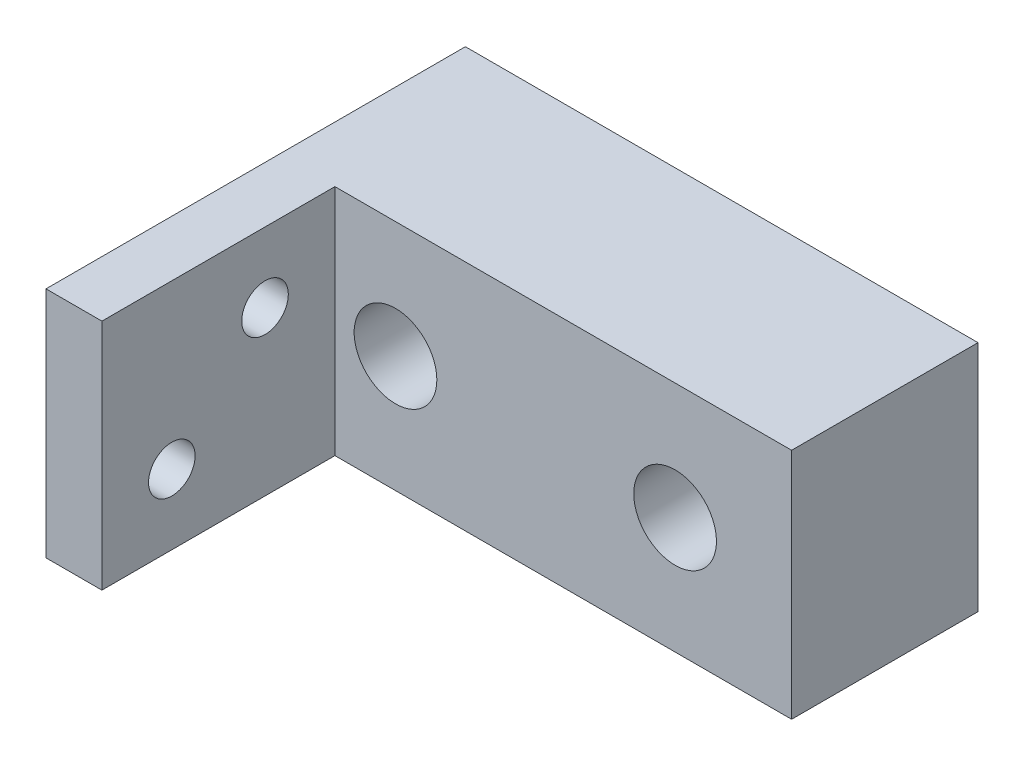
ISO-10303-21;
HEADER;
FILE_DESCRIPTION(('STEP AP214'),'2;1');
FILE_NAME('part.step','',(''),(''),'','','');
FILE_SCHEMA(('AUTOMOTIVE_DESIGN { 1 0 10303 214 1 1 1 1 }'));
ENDSEC;
DATA;
#1=APPLICATION_CONTEXT('core data for automotive mechanical design processes');
#2=APPLICATION_PROTOCOL_DEFINITION('international standard','automotive_design',2000,#1);
#3=PRODUCT_CONTEXT('',#1,'mechanical');
#4=PRODUCT('Part','Part','',(#3));
#5=PRODUCT_RELATED_PRODUCT_CATEGORY('part','',(#4));
#6=PRODUCT_DEFINITION_FORMATION('','',#4);
#7=PRODUCT_DEFINITION_CONTEXT('part definition',#1,'design');
#8=PRODUCT_DEFINITION('design','',#6,#7);
#9=PRODUCT_DEFINITION_SHAPE('','',#8);
#10=(LENGTH_UNIT() NAMED_UNIT(*) SI_UNIT(.MILLI.,.METRE.));
#11=(NAMED_UNIT(*) PLANE_ANGLE_UNIT() SI_UNIT($,.RADIAN.));
#12=(NAMED_UNIT(*) SI_UNIT($,.STERADIAN.) SOLID_ANGLE_UNIT());
#13=UNCERTAINTY_MEASURE_WITH_UNIT(LENGTH_MEASURE(1.E-05),#10,'distance_accuracy_value','');
#14=(GEOMETRIC_REPRESENTATION_CONTEXT(3) GLOBAL_UNCERTAINTY_ASSIGNED_CONTEXT((#13)) GLOBAL_UNIT_ASSIGNED_CONTEXT((#10,
#11,#12)) REPRESENTATION_CONTEXT('',''));
#15=CARTESIAN_POINT('',(0.,0.,0.));
#16=DIRECTION('',(0.,0.,1.));
#17=DIRECTION('',(1.,0.,0.));
#18=AXIS2_PLACEMENT_3D('',#15,#16,#17);
#19=CARTESIAN_POINT('',(0.,0.,20.));
#20=DIRECTION('',(0.,0.,-1.));
#21=DIRECTION('',(-1.,0.,0.));
#22=AXIS2_PLACEMENT_3D('',#19,#20,#21);
#23=PLANE('',#22);
#24=CARTESIAN_POINT('',(-7.68133333333334,7.82775566512345,20.));
#25=DIRECTION('',(0.,0.,1.));
#26=DIRECTION('',(-1.,0.,0.));
#27=AXIS2_PLACEMENT_3D('',#24,#25,#26);
#28=CIRCLE('',#27,4.43590065730548);
#29=CARTESIAN_POINT('',(-12.1172339906388,7.82775566512345,20.));
#30=VERTEX_POINT('',#29);
#31=EDGE_CURVE('E152',#30,#30,#28,.T.);
#32=ORIENTED_EDGE('',*,*,#31,.F.);
#33=EDGE_LOOP('',(#32));
#34=FACE_BOUND('',#33,.T.);
#35=CARTESIAN_POINT('',(-37.6813333333333,7.82775566512345,20.));
#36=DIRECTION('',(0.,0.,1.));
#37=DIRECTION('',(1.,0.,0.));
#38=AXIS2_PLACEMENT_3D('',#35,#36,#37);
#39=CIRCLE('',#38,4.43590065730549);
#40=CARTESIAN_POINT('',(-33.2454326760278,7.82775566512345,20.));
#41=VERTEX_POINT('',#40);
#42=EDGE_CURVE('E102',#41,#41,#39,.T.);
#43=ORIENTED_EDGE('',*,*,#42,.F.);
#44=EDGE_LOOP('',(#43));
#45=FACE_BOUND('',#44,.T.);
#46=DIRECTION('',(0.,1.,0.));
#47=VECTOR('',#46,1.);
#48=CARTESIAN_POINT('',(-44.1813333333333,20.3277556651234,20.));
#49=LINE('',#48,#47);
#50=CARTESIAN_POINT('',(-44.1813333333333,-4.67224433487655,20.));
#51=VERTEX_POINT('',#50);
#52=CARTESIAN_POINT('',(-44.1813333333333,20.3277556651234,20.));
#53=VERTEX_POINT('',#52);
#54=EDGE_CURVE('E50',#51,#53,#49,.T.);
#55=ORIENTED_EDGE('',*,*,#54,.F.);
#56=DIRECTION('',(1.,0.,0.));
#57=VECTOR('',#56,1.);
#58=CARTESIAN_POINT('',(4.81866666666667,-4.67224433487655,20.));
#59=LINE('',#58,#57);
#60=CARTESIAN_POINT('',(4.81866666666667,-4.67224433487655,20.));
#61=VERTEX_POINT('',#60);
#62=EDGE_CURVE('E87',#51,#61,#59,.T.);
#63=ORIENTED_EDGE('',*,*,#62,.T.);
#64=DIRECTION('',(0.,1.,0.));
#65=VECTOR('',#64,1.);
#66=CARTESIAN_POINT('',(4.81866666666667,20.3277556651234,20.));
#67=LINE('',#66,#65);
#68=CARTESIAN_POINT('',(4.81866666666667,20.3277556651234,20.));
#69=VERTEX_POINT('',#68);
#70=EDGE_CURVE('E56',#61,#69,#67,.T.);
#71=ORIENTED_EDGE('',*,*,#70,.T.);
#72=DIRECTION('',(-1.,0.,0.));
#73=VECTOR('',#72,1.);
#74=CARTESIAN_POINT('',(-50.1813333333333,20.3277556651234,20.));
#75=LINE('',#74,#73);
#76=EDGE_CURVE('E97',#69,#53,#75,.T.);
#77=ORIENTED_EDGE('',*,*,#76,.T.);
#78=EDGE_LOOP('',(#55,#63,#71,#77));
#79=FACE_BOUND('',#78,.T.);
#80=ADVANCED_FACE('F35',(#34,#45,#79),#23,.F.);
#81=CARTESIAN_POINT('',(0.,0.,0.));
#82=DIRECTION('',(0.,0.,-1.));
#83=DIRECTION('',(-1.,0.,0.));
#84=AXIS2_PLACEMENT_3D('',#81,#82,#83);
#85=PLANE('',#84);
#86=CARTESIAN_POINT('',(-37.6813333333333,7.82775566512345,0.));
#87=DIRECTION('',(0.,0.,1.));
#88=DIRECTION('',(1.,0.,0.));
#89=AXIS2_PLACEMENT_3D('',#86,#87,#88);
#90=CIRCLE('',#89,4.43590065730549);
#91=CARTESIAN_POINT('',(-33.2454326760278,7.82775566512345,0.));
#92=VERTEX_POINT('',#91);
#93=EDGE_CURVE('E106',#92,#92,#90,.T.);
#94=ORIENTED_EDGE('',*,*,#93,.T.);
#95=EDGE_LOOP('',(#94));
#96=FACE_BOUND('',#95,.T.);
#97=DIRECTION('',(0.,-1.,0.));
#98=VECTOR('',#97,1.);
#99=CARTESIAN_POINT('',(-50.1813333333333,-4.67224433487655,0.));
#100=LINE('',#99,#98);
#101=CARTESIAN_POINT('',(-50.1813333333333,20.3277556651234,0.));
#102=VERTEX_POINT('',#101);
#103=CARTESIAN_POINT('',(-50.1813333333333,-4.67224433487655,0.));
#104=VERTEX_POINT('',#103);
#105=EDGE_CURVE('E94',#102,#104,#100,.T.);
#106=ORIENTED_EDGE('',*,*,#105,.F.);
#107=DIRECTION('',(-1.,0.,0.));
#108=VECTOR('',#107,1.);
#109=CARTESIAN_POINT('',(-50.1813333333333,20.3277556651234,0.));
#110=LINE('',#109,#108);
#111=CARTESIAN_POINT('',(4.81866666666667,20.3277556651234,0.));
#112=VERTEX_POINT('',#111);
#113=EDGE_CURVE('E76',#112,#102,#110,.T.);
#114=ORIENTED_EDGE('',*,*,#113,.F.);
#115=DIRECTION('',(0.,1.,0.));
#116=VECTOR('',#115,1.);
#117=CARTESIAN_POINT('',(4.81866666666667,20.3277556651234,0.));
#118=LINE('',#117,#116);
#119=CARTESIAN_POINT('',(4.81866666666667,-4.67224433487655,0.));
#120=VERTEX_POINT('',#119);
#121=EDGE_CURVE('E88',#120,#112,#118,.T.);
#122=ORIENTED_EDGE('',*,*,#121,.F.);
#123=DIRECTION('',(1.,0.,0.));
#124=VECTOR('',#123,1.);
#125=CARTESIAN_POINT('',(4.81866666666667,-4.67224433487655,0.));
#126=LINE('',#125,#124);
#127=EDGE_CURVE('E101',#104,#120,#126,.T.);
#128=ORIENTED_EDGE('',*,*,#127,.F.);
#129=EDGE_LOOP('',(#106,#114,#122,#128));
#130=FACE_BOUND('',#129,.T.);
#131=CARTESIAN_POINT('',(-7.68133333333334,7.82775566512345,0.));
#132=DIRECTION('',(0.,0.,1.));
#133=DIRECTION('',(-1.,0.,0.));
#134=AXIS2_PLACEMENT_3D('',#131,#132,#133);
#135=CIRCLE('',#134,4.43590065730548);
#136=CARTESIAN_POINT('',(-12.1172339906388,7.82775566512345,0.));
#137=VERTEX_POINT('',#136);
#138=EDGE_CURVE('E151',#137,#137,#135,.T.);
#139=ORIENTED_EDGE('',*,*,#138,.T.);
#140=EDGE_LOOP('',(#139));
#141=FACE_BOUND('',#140,.T.);
#142=ADVANCED_FACE('F99',(#96,#130,#141),#85,.T.);
#143=CARTESIAN_POINT('',(-50.1813333333333,-4.67224433487655,20.));
#144=DIRECTION('',(1.,0.,0.));
#145=DIRECTION('',(0.,0.,-1.));
#146=AXIS2_PLACEMENT_3D('',#143,#144,#145);
#147=PLANE('',#146);
#148=CARTESIAN_POINT('',(-50.1813333333333,2.82775566512344,37.5));
#149=DIRECTION('',(1.,0.,0.));
#150=DIRECTION('',(0.,0.,-1.));
#151=AXIS2_PLACEMENT_3D('',#148,#149,#150);
#152=CIRCLE('',#151,2.5);
#153=CARTESIAN_POINT('',(-50.1813333333333,2.82775566512344,35.));
#154=VERTEX_POINT('',#153);
#155=EDGE_CURVE('E148',#154,#154,#152,.T.);
#156=ORIENTED_EDGE('',*,*,#155,.T.);
#157=EDGE_LOOP('',(#156));
#158=FACE_BOUND('',#157,.T.);
#159=CARTESIAN_POINT('',(-50.1813333333333,12.8277556651234,27.5));
#160=DIRECTION('',(1.,0.,0.));
#161=DIRECTION('',(0.,0.,-1.));
#162=AXIS2_PLACEMENT_3D('',#159,#160,#161);
#163=CIRCLE('',#162,2.5);
#164=CARTESIAN_POINT('',(-50.1813333333333,12.8277556651234,25.));
#165=VERTEX_POINT('',#164);
#166=EDGE_CURVE('E188',#165,#165,#163,.T.);
#167=ORIENTED_EDGE('',*,*,#166,.T.);
#168=EDGE_LOOP('',(#167));
#169=FACE_BOUND('',#168,.T.);
#170=ORIENTED_EDGE('',*,*,#105,.T.);
#171=DIRECTION('',(0.,0.,-1.));
#172=VECTOR('',#171,1.);
#173=CARTESIAN_POINT('',(-50.1813333333333,-4.67224433487655,20.));
#174=LINE('',#173,#172);
#175=CARTESIAN_POINT('',(-50.1813333333333,-4.67224433487655,45.));
#176=VERTEX_POINT('',#175);
#177=EDGE_CURVE('E11',#176,#104,#174,.T.);
#178=ORIENTED_EDGE('',*,*,#177,.F.);
#179=DIRECTION('',(0.,-1.,0.));
#180=VECTOR('',#179,1.);
#181=CARTESIAN_POINT('',(-50.1813333333333,-4.67224433487655,45.));
#182=LINE('',#181,#180);
#183=CARTESIAN_POINT('',(-50.1813333333333,20.3277556651234,45.));
#184=VERTEX_POINT('',#183);
#185=EDGE_CURVE('E96',#184,#176,#182,.T.);
#186=ORIENTED_EDGE('',*,*,#185,.F.);
#187=DIRECTION('',(0.,0.,-1.));
#188=VECTOR('',#187,1.);
#189=CARTESIAN_POINT('',(-50.1813333333333,20.3277556651234,20.));
#190=LINE('',#189,#188);
#191=EDGE_CURVE('E80',#184,#102,#190,.T.);
#192=ORIENTED_EDGE('',*,*,#191,.T.);
#193=EDGE_LOOP('',(#170,#178,#186,#192));
#194=FACE_BOUND('',#193,.T.);
#195=ADVANCED_FACE('F37',(#158,#169,#194),#147,.F.);
#196=CARTESIAN_POINT('',(4.81866666666667,-4.67224433487655,20.));
#197=DIRECTION('',(0.,1.,0.));
#198=DIRECTION('',(0.,0.,1.));
#199=AXIS2_PLACEMENT_3D('',#196,#197,#198);
#200=PLANE('',#199);
#201=ORIENTED_EDGE('',*,*,#127,.T.);
#202=DIRECTION('',(0.,0.,-1.));
#203=VECTOR('',#202,1.);
#204=CARTESIAN_POINT('',(4.81866666666667,-4.67224433487655,20.));
#205=LINE('',#204,#203);
#206=EDGE_CURVE('E43',#61,#120,#205,.T.);
#207=ORIENTED_EDGE('',*,*,#206,.F.);
#208=ORIENTED_EDGE('',*,*,#62,.F.);
#209=DIRECTION('',(0.,0.,-1.));
#210=VECTOR('',#209,1.);
#211=CARTESIAN_POINT('',(-44.1813333333333,-4.67224433487655,45.));
#212=LINE('',#211,#210);
#213=CARTESIAN_POINT('',(-44.1813333333333,-4.67224433487655,45.));
#214=VERTEX_POINT('',#213);
#215=EDGE_CURVE('E143',#214,#51,#212,.T.);
#216=ORIENTED_EDGE('',*,*,#215,.F.);
#217=DIRECTION('',(1.,0.,0.));
#218=VECTOR('',#217,1.);
#219=CARTESIAN_POINT('',(-44.1813333333333,-4.67224433487655,45.));
#220=LINE('',#219,#218);
#221=EDGE_CURVE('E123',#176,#214,#220,.T.);
#222=ORIENTED_EDGE('',*,*,#221,.F.);
#223=ORIENTED_EDGE('',*,*,#177,.T.);
#224=EDGE_LOOP('',(#201,#207,#208,#216,#222,#223));
#225=FACE_BOUND('',#224,.T.);
#226=ADVANCED_FACE('F117',(#225),#200,.F.);
#227=CARTESIAN_POINT('',(4.81866666666667,20.3277556651234,20.));
#228=DIRECTION('',(-1.,0.,0.));
#229=DIRECTION('',(0.,0.,1.));
#230=AXIS2_PLACEMENT_3D('',#227,#228,#229);
#231=PLANE('',#230);
#232=ORIENTED_EDGE('',*,*,#121,.T.);
#233=DIRECTION('',(0.,0.,-1.));
#234=VECTOR('',#233,1.);
#235=CARTESIAN_POINT('',(4.81866666666667,20.3277556651234,20.));
#236=LINE('',#235,#234);
#237=EDGE_CURVE('E83',#69,#112,#236,.T.);
#238=ORIENTED_EDGE('',*,*,#237,.F.);
#239=ORIENTED_EDGE('',*,*,#70,.F.);
#240=ORIENTED_EDGE('',*,*,#206,.T.);
#241=EDGE_LOOP('',(#232,#238,#239,#240));
#242=FACE_BOUND('',#241,.T.);
#243=ADVANCED_FACE('F115',(#242),#231,.F.);
#244=CARTESIAN_POINT('',(-50.1813333333333,20.3277556651234,20.));
#245=DIRECTION('',(0.,-1.,0.));
#246=DIRECTION('',(1.,0.,0.));
#247=AXIS2_PLACEMENT_3D('',#244,#245,#246);
#248=PLANE('',#247);
#249=ORIENTED_EDGE('',*,*,#113,.T.);
#250=ORIENTED_EDGE('',*,*,#191,.F.);
#251=DIRECTION('',(-1.,0.,0.));
#252=VECTOR('',#251,1.);
#253=CARTESIAN_POINT('',(-50.1813333333333,20.3277556651234,45.));
#254=LINE('',#253,#252);
#255=CARTESIAN_POINT('',(-44.1813333333333,20.3277556651234,45.));
#256=VERTEX_POINT('',#255);
#257=EDGE_CURVE('E137',#256,#184,#254,.T.);
#258=ORIENTED_EDGE('',*,*,#257,.F.);
#259=DIRECTION('',(0.,0.,-1.));
#260=VECTOR('',#259,1.);
#261=CARTESIAN_POINT('',(-44.1813333333333,20.3277556651234,45.));
#262=LINE('',#261,#260);
#263=EDGE_CURVE('E141',#256,#53,#262,.T.);
#264=ORIENTED_EDGE('',*,*,#263,.T.);
#265=ORIENTED_EDGE('',*,*,#76,.F.);
#266=ORIENTED_EDGE('',*,*,#237,.T.);
#267=EDGE_LOOP('',(#249,#250,#258,#264,#265,#266));
#268=FACE_BOUND('',#267,.T.);
#269=ADVANCED_FACE('F78',(#268),#248,.F.);
#270=CARTESIAN_POINT('',(-37.6813333333333,7.82775566512345,20.));
#271=DIRECTION('',(0.,0.,-1.));
#272=DIRECTION('',(-1.,0.,0.));
#273=AXIS2_PLACEMENT_3D('',#270,#271,#272);
#274=CYLINDRICAL_SURFACE('',#273,4.43590065730549);
#275=ORIENTED_EDGE('',*,*,#42,.T.);
#276=EDGE_LOOP('',(#275));
#277=FACE_BOUND('',#276,.T.);
#278=ORIENTED_EDGE('',*,*,#93,.F.);
#279=EDGE_LOOP('',(#278));
#280=FACE_BOUND('',#279,.T.);
#281=ADVANCED_FACE('F170',(#277,#280),#274,.F.);
#282=CARTESIAN_POINT('',(-7.68133333333334,7.82775566512345,20.));
#283=DIRECTION('',(0.,0.,-1.));
#284=DIRECTION('',(-1.,0.,0.));
#285=AXIS2_PLACEMENT_3D('',#282,#283,#284);
#286=CYLINDRICAL_SURFACE('',#285,4.43590065730548);
#287=ORIENTED_EDGE('',*,*,#31,.T.);
#288=EDGE_LOOP('',(#287));
#289=FACE_BOUND('',#288,.T.);
#290=ORIENTED_EDGE('',*,*,#138,.F.);
#291=EDGE_LOOP('',(#290));
#292=FACE_BOUND('',#291,.T.);
#293=ADVANCED_FACE('F205',(#289,#292),#286,.F.);
#294=CARTESIAN_POINT('',(-44.1813333333333,20.3277556651234,45.));
#295=DIRECTION('',(-1.,0.,0.));
#296=DIRECTION('',(0.,0.,1.));
#297=AXIS2_PLACEMENT_3D('',#294,#295,#296);
#298=PLANE('',#297);
#299=CARTESIAN_POINT('',(-44.1813333333333,2.82775566512344,37.5));
#300=DIRECTION('',(1.,0.,0.));
#301=DIRECTION('',(0.,0.,-1.));
#302=AXIS2_PLACEMENT_3D('',#299,#300,#301);
#303=CIRCLE('',#302,2.5);
#304=CARTESIAN_POINT('',(-44.1813333333333,2.82775566512344,35.));
#305=VERTEX_POINT('',#304);
#306=EDGE_CURVE('E193',#305,#305,#303,.T.);
#307=ORIENTED_EDGE('',*,*,#306,.F.);
#308=EDGE_LOOP('',(#307));
#309=FACE_BOUND('',#308,.T.);
#310=CARTESIAN_POINT('',(-44.1813333333333,12.8277556651234,27.5));
#311=DIRECTION('',(1.,0.,0.));
#312=DIRECTION('',(0.,0.,-1.));
#313=AXIS2_PLACEMENT_3D('',#310,#311,#312);
#314=CIRCLE('',#313,2.5);
#315=CARTESIAN_POINT('',(-44.1813333333333,12.8277556651234,25.));
#316=VERTEX_POINT('',#315);
#317=EDGE_CURVE('E190',#316,#316,#314,.T.);
#318=ORIENTED_EDGE('',*,*,#317,.F.);
#319=EDGE_LOOP('',(#318));
#320=FACE_BOUND('',#319,.T.);
#321=ORIENTED_EDGE('',*,*,#54,.T.);
#322=ORIENTED_EDGE('',*,*,#263,.F.);
#323=DIRECTION('',(0.,1.,0.));
#324=VECTOR('',#323,1.);
#325=CARTESIAN_POINT('',(-44.1813333333333,20.3277556651234,45.));
#326=LINE('',#325,#324);
#327=EDGE_CURVE('E134',#214,#256,#326,.T.);
#328=ORIENTED_EDGE('',*,*,#327,.F.);
#329=ORIENTED_EDGE('',*,*,#215,.T.);
#330=EDGE_LOOP('',(#321,#322,#328,#329));
#331=FACE_BOUND('',#330,.T.);
#332=ADVANCED_FACE('F142',(#309,#320,#331),#298,.F.);
#333=CARTESIAN_POINT('',(0.,0.,45.));
#334=DIRECTION('',(0.,0.,-1.));
#335=DIRECTION('',(-1.,0.,0.));
#336=AXIS2_PLACEMENT_3D('',#333,#334,#335);
#337=PLANE('',#336);
#338=ORIENTED_EDGE('',*,*,#185,.T.);
#339=ORIENTED_EDGE('',*,*,#221,.T.);
#340=ORIENTED_EDGE('',*,*,#327,.T.);
#341=ORIENTED_EDGE('',*,*,#257,.T.);
#342=EDGE_LOOP('',(#338,#339,#340,#341));
#343=FACE_BOUND('',#342,.T.);
#344=ADVANCED_FACE('F136',(#343),#337,.F.);
#345=CARTESIAN_POINT('',(-50.1813333333333,12.8277556651234,27.5));
#346=DIRECTION('',(1.,0.,0.));
#347=DIRECTION('',(0.,0.,-1.));
#348=AXIS2_PLACEMENT_3D('',#345,#346,#347);
#349=CYLINDRICAL_SURFACE('',#348,2.5);
#350=ORIENTED_EDGE('',*,*,#166,.F.);
#351=EDGE_LOOP('',(#350));
#352=FACE_BOUND('',#351,.T.);
#353=ORIENTED_EDGE('',*,*,#317,.T.);
#354=EDGE_LOOP('',(#353));
#355=FACE_BOUND('',#354,.T.);
#356=ADVANCED_FACE('F209',(#352,#355),#349,.F.);
#357=CARTESIAN_POINT('',(-50.1813333333333,2.82775566512344,37.5));
#358=DIRECTION('',(1.,0.,0.));
#359=DIRECTION('',(0.,0.,-1.));
#360=AXIS2_PLACEMENT_3D('',#357,#358,#359);
#361=CYLINDRICAL_SURFACE('',#360,2.5);
#362=ORIENTED_EDGE('',*,*,#155,.F.);
#363=EDGE_LOOP('',(#362));
#364=FACE_BOUND('',#363,.T.);
#365=ORIENTED_EDGE('',*,*,#306,.T.);
#366=EDGE_LOOP('',(#365));
#367=FACE_BOUND('',#366,.T.);
#368=ADVANCED_FACE('F201',(#364,#367),#361,.F.);
#369=CLOSED_SHELL('',(#80,#142,#195,#226,#243,#269,#281,#293,#332,#344,#356,#368));
#370=MANIFOLD_SOLID_BREP('B2',#369);
#371=ADVANCED_BREP_SHAPE_REPRESENTATION('',(#18,#370),#14);
#372=SHAPE_DEFINITION_REPRESENTATION(#9,#371);
ENDSEC;
END-ISO-10303-21;
